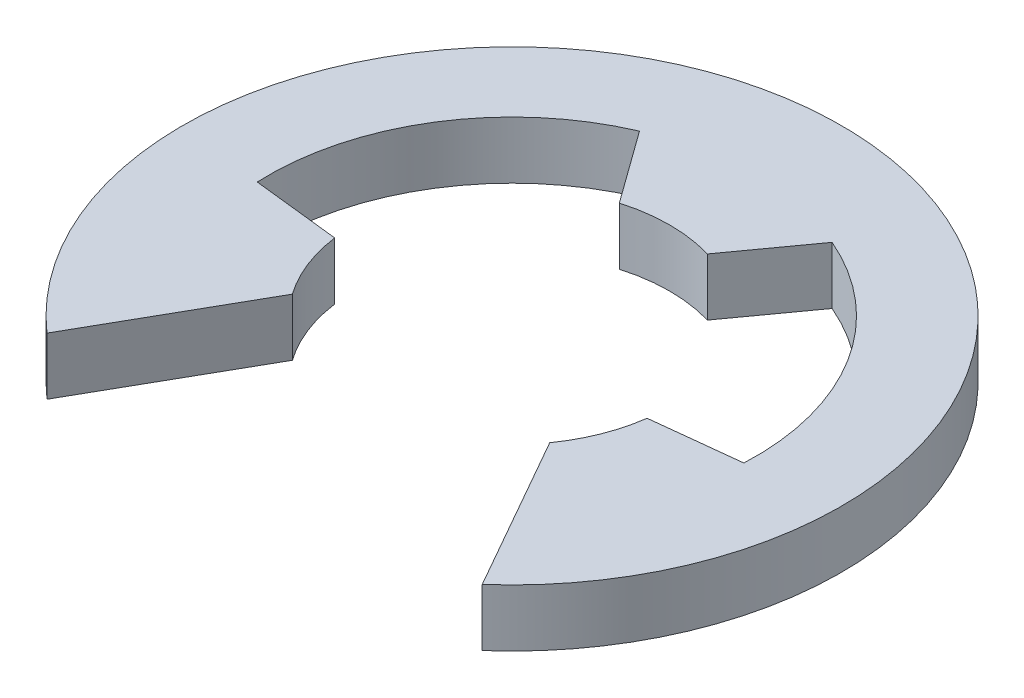
ISO-10303-21;
HEADER;
FILE_DESCRIPTION(('STEP AP214'),'2;1');
FILE_NAME('part.step','',(''),(''),'','','');
FILE_SCHEMA(('AUTOMOTIVE_DESIGN { 1 0 10303 214 1 1 1 1 }'));
ENDSEC;
DATA;
#1=APPLICATION_CONTEXT('core data for automotive mechanical design processes');
#2=APPLICATION_PROTOCOL_DEFINITION('international standard','automotive_design',2000,#1);
#3=PRODUCT_CONTEXT('',#1,'mechanical');
#4=PRODUCT('Part','Part','',(#3));
#5=PRODUCT_RELATED_PRODUCT_CATEGORY('part','',(#4));
#6=PRODUCT_DEFINITION_FORMATION('','',#4);
#7=PRODUCT_DEFINITION_CONTEXT('part definition',#1,'design');
#8=PRODUCT_DEFINITION('design','',#6,#7);
#9=PRODUCT_DEFINITION_SHAPE('','',#8);
#10=(LENGTH_UNIT() NAMED_UNIT(*) SI_UNIT(.MILLI.,.METRE.));
#11=(NAMED_UNIT(*) PLANE_ANGLE_UNIT() SI_UNIT($,.RADIAN.));
#12=(NAMED_UNIT(*) SI_UNIT($,.STERADIAN.) SOLID_ANGLE_UNIT());
#13=UNCERTAINTY_MEASURE_WITH_UNIT(LENGTH_MEASURE(1.E-05),#10,'distance_accuracy_value','');
#14=(GEOMETRIC_REPRESENTATION_CONTEXT(3) GLOBAL_UNCERTAINTY_ASSIGNED_CONTEXT((#13)) GLOBAL_UNIT_ASSIGNED_CONTEXT((#10,
#11,#12)) REPRESENTATION_CONTEXT('',''));
#15=CARTESIAN_POINT('',(0.,0.,0.));
#16=DIRECTION('',(0.,0.,1.));
#17=DIRECTION('',(1.,0.,0.));
#18=AXIS2_PLACEMENT_3D('',#15,#16,#17);
#19=CARTESIAN_POINT('',(1.929015529,0.,2.193431123));
#20=DIRECTION('',(0.86935088519939,0.,-0.494195344376126));
#21=DIRECTION('',(-0.494195344376126,0.,-0.86935088519939));
#22=AXIS2_PLACEMENT_3D('',#19,#20,#21);
#23=PLANE('',#22);
#24=DIRECTION('',(0.,-1.,0.));
#25=VECTOR('',#24,1.);
#26=CARTESIAN_POINT('',(1.92901552951474,0.254,2.19343112198468));
#27=LINE('',#26,#25);
#28=CARTESIAN_POINT('',(1.92901552968591,0.,2.19343112183415));
#29=VERTEX_POINT('',#28);
#30=CARTESIAN_POINT('',(1.92901552915076,0.508,2.19343112230479));
#31=VERTEX_POINT('',#30);
#32=EDGE_CURVE('E116',#29,#31,#27,.F.);
#33=ORIENTED_EDGE('',*,*,#32,.T.);
#34=DIRECTION('',(-0.494195344376126,0.,-0.86935088519939));
#35=VECTOR('',#34,1.);
#36=CARTESIAN_POINT('',(1.929015529,0.508,2.193431123));
#37=LINE('',#36,#35);
#38=CARTESIAN_POINT('',(1.14063546282,0.508,0.806572836734169));
#39=VERTEX_POINT('',#38);
#40=EDGE_CURVE('E125',#31,#39,#37,.T.);
#41=ORIENTED_EDGE('',*,*,#40,.T.);
#42=DIRECTION('',(0.,-1.,0.));
#43=VECTOR('',#42,1.);
#44=CARTESIAN_POINT('',(1.14063546280399,0.254,0.806572836756812));
#45=LINE('',#44,#43);
#46=CARTESIAN_POINT('',(1.14063546233232,0.,0.806572837423838));
#47=VERTEX_POINT('',#46);
#48=EDGE_CURVE('E159',#47,#39,#45,.F.);
#49=ORIENTED_EDGE('',*,*,#48,.F.);
#50=DIRECTION('',(-0.49419534597024,0.,-0.869350884293192));
#51=VECTOR('',#50,1.);
#52=CARTESIAN_POINT('',(1.92901552946643,0.,2.19343112099644));
#53=LINE('',#52,#51);
#54=EDGE_CURVE('E120',#29,#47,#53,.T.);
#55=ORIENTED_EDGE('',*,*,#54,.F.);
#56=EDGE_LOOP('',(#33,#41,#49,#55));
#57=FACE_BOUND('',#56,.T.);
#58=ADVANCED_FACE('F17',(#57),#23,.F.);
#59=CARTESIAN_POINT('',(0.,0.508,0.));
#60=DIRECTION('',(0.,-1.,0.));
#61=DIRECTION('',(0.,0.,-1.));
#62=AXIS2_PLACEMENT_3D('',#59,#60,#61);
#63=CYLINDRICAL_SURFACE('',#62,1.397);
#64=CARTESIAN_POINT('',(0.,0.508,0.));
#65=DIRECTION('',(0.,-1.,0.));
#66=DIRECTION('',(0.,0.,-1.));
#67=AXIS2_PLACEMENT_3D('',#64,#65,#66);
#68=CIRCLE('',#67,1.397);
#69=CARTESIAN_POINT('',(1.38434536579565,0.508,0.187608392022745));
#70=VERTEX_POINT('',#69);
#71=EDGE_CURVE('E127',#39,#70,#68,.F.);
#72=ORIENTED_EDGE('',*,*,#71,.T.);
#73=DIRECTION('',(0.,-1.,0.));
#74=VECTOR('',#73,1.);
#75=CARTESIAN_POINT('',(1.384345366,0.254,0.187608392));
#76=LINE('',#75,#74);
#77=CARTESIAN_POINT('',(1.38434536581451,0.,0.187608391883578));
#78=VERTEX_POINT('',#77);
#79=EDGE_CURVE('E162',#70,#78,#76,.T.);
#80=ORIENTED_EDGE('',*,*,#79,.T.);
#81=CARTESIAN_POINT('',(0.,0.,0.));
#82=DIRECTION('',(0.,-1.,0.));
#83=DIRECTION('',(0.,0.,-1.));
#84=AXIS2_PLACEMENT_3D('',#81,#82,#83);
#85=CIRCLE('',#84,1.397);
#86=EDGE_CURVE('E149',#47,#78,#85,.F.);
#87=ORIENTED_EDGE('',*,*,#86,.F.);
#88=ORIENTED_EDGE('',*,*,#48,.T.);
#89=EDGE_LOOP('',(#72,#80,#87,#88));
#90=FACE_BOUND('',#89,.T.);
#91=ADVANCED_FACE('F164',(#90),#63,.F.);
#92=CARTESIAN_POINT('',(1.384345366,0.,0.187608392));
#93=DIRECTION('',(0.110618200045199,0.,0.993862975373749));
#94=DIRECTION('',(0.993862975373749,0.,-0.110618200045199));
#95=AXIS2_PLACEMENT_3D('',#92,#93,#94);
#96=PLANE('',#95);
#97=ORIENTED_EDGE('',*,*,#79,.F.);
#98=DIRECTION('',(0.993862975373749,0.,-0.110618200045199));
#99=VECTOR('',#98,1.);
#100=CARTESIAN_POINT('',(1.384345366,0.508,0.187608392));
#101=LINE('',#100,#99);
#102=CARTESIAN_POINT('',(2.15660550124388,0.508,0.101654867097534));
#103=VERTEX_POINT('',#102);
#104=EDGE_CURVE('E212',#70,#103,#101,.T.);
#105=ORIENTED_EDGE('',*,*,#104,.T.);
#106=DIRECTION('',(0.,-1.,0.));
#107=VECTOR('',#106,1.);
#108=CARTESIAN_POINT('',(2.15660550123798,0.254,0.101654867222869));
#109=LINE('',#108,#107);
#110=CARTESIAN_POINT('',(2.15660550127173,0.,0.101654866506799));
#111=VERTEX_POINT('',#110);
#112=EDGE_CURVE('E169',#111,#103,#109,.F.);
#113=ORIENTED_EDGE('',*,*,#112,.F.);
#114=DIRECTION('',(0.99386297524625,0.,-0.110618201190729));
#115=VECTOR('',#114,1.);
#116=CARTESIAN_POINT('',(1.38434536586914,0.,0.187608391740431));
#117=LINE('',#116,#115);
#118=EDGE_CURVE('E146',#78,#111,#117,.T.);
#119=ORIENTED_EDGE('',*,*,#118,.F.);
#120=EDGE_LOOP('',(#97,#105,#113,#119));
#121=FACE_BOUND('',#120,.T.);
#122=ADVANCED_FACE('F171',(#121),#96,.F.);
#123=CARTESIAN_POINT('',(0.,0.508,0.));
#124=DIRECTION('',(0.,-1.,0.));
#125=DIRECTION('',(0.,0.,-1.));
#126=AXIS2_PLACEMENT_3D('',#123,#124,#125);
#127=CYLINDRICAL_SURFACE('',#126,2.159);
#128=CARTESIAN_POINT('',(0.,0.508,0.));
#129=DIRECTION('',(0.,-1.,0.));
#130=DIRECTION('',(0.,0.,-1.));
#131=AXIS2_PLACEMENT_3D('',#128,#129,#130);
#132=CIRCLE('',#131,2.159);
#133=CARTESIAN_POINT('',(0.853616211139097,0.508,-1.98308354919271));
#134=VERTEX_POINT('',#133);
#135=EDGE_CURVE('E180',#103,#134,#132,.F.);
#136=ORIENTED_EDGE('',*,*,#135,.T.);
#137=DIRECTION('',(0.,-1.,0.));
#138=VECTOR('',#137,1.);
#139=CARTESIAN_POINT('',(0.853616211,0.254,-1.983083549));
#140=LINE('',#139,#138);
#141=CARTESIAN_POINT('',(0.853616210756976,0.,-1.98308354935719));
#142=VERTEX_POINT('',#141);
#143=EDGE_CURVE('E179',#134,#142,#140,.T.);
#144=ORIENTED_EDGE('',*,*,#143,.T.);
#145=CARTESIAN_POINT('',(0.,0.,0.));
#146=DIRECTION('',(0.,-1.,0.));
#147=DIRECTION('',(0.,0.,-1.));
#148=AXIS2_PLACEMENT_3D('',#145,#146,#147);
#149=CIRCLE('',#148,2.159);
#150=EDGE_CURVE('E143',#111,#142,#149,.F.);
#151=ORIENTED_EDGE('',*,*,#150,.F.);
#152=ORIENTED_EDGE('',*,*,#112,.T.);
#153=EDGE_LOOP('',(#136,#144,#151,#152));
#154=FACE_BOUND('',#153,.T.);
#155=ADVANCED_FACE('F176',(#154),#127,.F.);
#156=CARTESIAN_POINT('',(0.853616211,0.,-1.983083549));
#157=DIRECTION('',(-0.810841332220513,0.,-0.585266036912158));
#158=DIRECTION('',(-0.585266036912158,0.,0.810841332220513));
#159=AXIS2_PLACEMENT_3D('',#156,#157,#158);
#160=PLANE('',#159);
#161=ORIENTED_EDGE('',*,*,#143,.F.);
#162=DIRECTION('',(-0.585266036912158,0.,0.810841332220513));
#163=VECTOR('',#162,1.);
#164=CARTESIAN_POINT('',(0.853616211,0.508,-1.983083549));
#165=LINE('',#164,#163);
#166=CARTESIAN_POINT('',(0.39040508032633,0.508,-1.34133995439463));
#167=VERTEX_POINT('',#166);
#168=EDGE_CURVE('E189',#134,#167,#165,.T.);
#169=ORIENTED_EDGE('',*,*,#168,.T.);
#170=DIRECTION('',(0.,-1.,0.));
#171=VECTOR('',#170,1.);
#172=CARTESIAN_POINT('',(0.390405080360612,0.254,-1.34133995438465));
#173=LINE('',#172,#171);
#174=CARTESIAN_POINT('',(0.390405080040821,0.,-1.34133995447773));
#175=VERTEX_POINT('',#174);
#176=EDGE_CURVE('E184',#175,#167,#173,.F.);
#177=ORIENTED_EDGE('',*,*,#176,.F.);
#178=DIRECTION('',(-0.585266036654048,0.,0.810841332406817));
#179=VECTOR('',#178,1.);
#180=CARTESIAN_POINT('',(0.85361620954852,0.,-1.98308354837685));
#181=LINE('',#180,#179);
#182=EDGE_CURVE('E140',#142,#175,#181,.T.);
#183=ORIENTED_EDGE('',*,*,#182,.F.);
#184=EDGE_LOOP('',(#161,#169,#177,#183));
#185=FACE_BOUND('',#184,.T.);
#186=ADVANCED_FACE('F187',(#185),#160,.F.);
#187=CARTESIAN_POINT('',(0.,0.508,0.));
#188=DIRECTION('',(0.,-1.,0.));
#189=DIRECTION('',(0.,0.,-1.));
#190=AXIS2_PLACEMENT_3D('',#187,#188,#189);
#191=CYLINDRICAL_SURFACE('',#190,1.397);
#192=DIRECTION('',(0.,-1.,0.));
#193=VECTOR('',#192,1.);
#194=CARTESIAN_POINT('',(-0.39040508,0.254,-1.341339954));
#195=LINE('',#194,#193);
#196=CARTESIAN_POINT('',(-0.390405080146024,0.508,-1.3413399542023));
#197=VERTEX_POINT('',#196);
#198=CARTESIAN_POINT('',(-0.390405079860515,0.,-1.3413399542854));
#199=VERTEX_POINT('',#198);
#200=EDGE_CURVE('E191',#197,#199,#195,.T.);
#201=ORIENTED_EDGE('',*,*,#200,.T.);
#202=CARTESIAN_POINT('',(0.,0.,0.));
#203=DIRECTION('',(0.,-1.,0.));
#204=DIRECTION('',(0.,0.,-1.));
#205=AXIS2_PLACEMENT_3D('',#202,#203,#204);
#206=CIRCLE('',#205,1.397);
#207=EDGE_CURVE('E137',#175,#199,#206,.F.);
#208=ORIENTED_EDGE('',*,*,#207,.F.);
#209=ORIENTED_EDGE('',*,*,#176,.T.);
#210=CARTESIAN_POINT('',(0.,0.508,0.));
#211=DIRECTION('',(0.,-1.,0.));
#212=DIRECTION('',(0.,0.,-1.));
#213=AXIS2_PLACEMENT_3D('',#210,#211,#212);
#214=CIRCLE('',#213,1.397);
#215=EDGE_CURVE('E208',#167,#197,#214,.F.);
#216=ORIENTED_EDGE('',*,*,#215,.T.);
#217=EDGE_LOOP('',(#201,#208,#209,#216));
#218=FACE_BOUND('',#217,.T.);
#219=ADVANCED_FACE('F217',(#218),#191,.F.);
#220=CARTESIAN_POINT('',(-0.39040508,0.,-1.341339954));
#221=DIRECTION('',(0.810841332220513,0.,-0.585266036912158));
#222=DIRECTION('',(-0.585266036912158,0.,-0.810841332220513));
#223=AXIS2_PLACEMENT_3D('',#220,#221,#222);
#224=PLANE('',#223);
#225=ORIENTED_EDGE('',*,*,#200,.F.);
#226=DIRECTION('',(-0.585266036912158,0.,-0.810841332220513));
#227=VECTOR('',#226,1.);
#228=CARTESIAN_POINT('',(-0.39040508,0.508,-1.341339954));
#229=LINE('',#228,#227);
#230=CARTESIAN_POINT('',(-0.853616211784646,0.508,-1.98308354916741));
#231=VERTEX_POINT('',#230);
#232=EDGE_CURVE('E206',#197,#231,#229,.T.);
#233=ORIENTED_EDGE('',*,*,#232,.T.);
#234=DIRECTION('',(0.,-1.,0.));
#235=VECTOR('',#234,1.);
#236=CARTESIAN_POINT('',(-0.853616212291097,0.254,-1.98308354894941));
#237=LINE('',#236,#235);
#238=CARTESIAN_POINT('',(-0.853616211402524,0.,-1.9830835493319));
#239=VERTEX_POINT('',#238);
#240=EDGE_CURVE('E193',#239,#231,#237,.F.);
#241=ORIENTED_EDGE('',*,*,#240,.F.);
#242=DIRECTION('',(-0.585266036654048,0.,-0.810841332406817));
#243=VECTOR('',#242,1.);
#244=CARTESIAN_POINT('',(-0.390405078187519,0.,-1.34133995244625));
#245=LINE('',#244,#243);
#246=EDGE_CURVE('E134',#199,#239,#245,.T.);
#247=ORIENTED_EDGE('',*,*,#246,.F.);
#248=EDGE_LOOP('',(#225,#233,#241,#247));
#249=FACE_BOUND('',#248,.T.);
#250=ADVANCED_FACE('F220',(#249),#224,.F.);
#251=CARTESIAN_POINT('',(0.,0.508,0.));
#252=DIRECTION('',(0.,-1.,0.));
#253=DIRECTION('',(0.,0.,-1.));
#254=AXIS2_PLACEMENT_3D('',#251,#252,#253);
#255=CYLINDRICAL_SURFACE('',#254,2.159);
#256=CARTESIAN_POINT('',(0.,0.508,0.));
#257=DIRECTION('',(0.,-1.,0.));
#258=DIRECTION('',(0.,0.,-1.));
#259=AXIS2_PLACEMENT_3D('',#256,#257,#258);
#260=CIRCLE('',#259,2.159);
#261=CARTESIAN_POINT('',(-2.1566055011249,0.508,0.101654866986099));
#262=VERTEX_POINT('',#261);
#263=EDGE_CURVE('E204',#231,#262,#260,.F.);
#264=ORIENTED_EDGE('',*,*,#263,.T.);
#265=DIRECTION('',(0.,-1.,0.));
#266=VECTOR('',#265,1.);
#267=CARTESIAN_POINT('',(-2.156605501,0.254,0.101654867));
#268=LINE('',#267,#266);
#269=CARTESIAN_POINT('',(-2.15660550115274,0.,0.101654866395364));
#270=VERTEX_POINT('',#269);
#271=EDGE_CURVE('E226',#262,#270,#268,.T.);
#272=ORIENTED_EDGE('',*,*,#271,.T.);
#273=CARTESIAN_POINT('',(0.,0.,0.));
#274=DIRECTION('',(0.,-1.,0.));
#275=DIRECTION('',(0.,0.,-1.));
#276=AXIS2_PLACEMENT_3D('',#273,#274,#275);
#277=CIRCLE('',#276,2.159);
#278=EDGE_CURVE('E129',#239,#270,#277,.F.);
#279=ORIENTED_EDGE('',*,*,#278,.F.);
#280=ORIENTED_EDGE('',*,*,#240,.T.);
#281=EDGE_LOOP('',(#264,#272,#279,#280));
#282=FACE_BOUND('',#281,.T.);
#283=ADVANCED_FACE('F224',(#282),#255,.F.);
#284=CARTESIAN_POINT('',(-2.156605501,0.,0.101654867));
#285=DIRECTION('',(-0.110618200045199,0.,0.993862975373749));
#286=DIRECTION('',(0.993862975373749,0.,0.110618200045199));
#287=AXIS2_PLACEMENT_3D('',#284,#285,#286);
#288=PLANE('',#287);
#289=ORIENTED_EDGE('',*,*,#271,.F.);
#290=DIRECTION('',(0.993862975373749,0.,0.110618200045199));
#291=VECTOR('',#290,1.);
#292=CARTESIAN_POINT('',(-2.156605501,0.508,0.101654867));
#293=LINE('',#292,#291);
#294=CARTESIAN_POINT('',(-1.38434536563138,0.508,0.187608391749766));
#295=VERTEX_POINT('',#294);
#296=EDGE_CURVE('E202',#262,#295,#293,.T.);
#297=ORIENTED_EDGE('',*,*,#296,.T.);
#298=DIRECTION('',(0.,-1.,0.));
#299=VECTOR('',#298,1.);
#300=CARTESIAN_POINT('',(-1.38434536567145,0.254,0.187608391454042));
#301=LINE('',#300,#299);
#302=CARTESIAN_POINT('',(-1.38434536565024,0.,0.187608391610599));
#303=VERTEX_POINT('',#302);
#304=EDGE_CURVE('E229',#303,#295,#301,.F.);
#305=ORIENTED_EDGE('',*,*,#304,.F.);
#306=DIRECTION('',(0.99386297524625,0.,0.110618201190729));
#307=VECTOR('',#306,1.);
#308=CARTESIAN_POINT('',(-2.15660550247252,0.,0.101654865660836));
#309=LINE('',#308,#307);
#310=EDGE_CURVE('E124',#270,#303,#309,.T.);
#311=ORIENTED_EDGE('',*,*,#310,.F.);
#312=EDGE_LOOP('',(#289,#297,#305,#311));
#313=FACE_BOUND('',#312,.T.);
#314=ADVANCED_FACE('F231',(#313),#288,.F.);
#315=CARTESIAN_POINT('',(0.,0.508,0.));
#316=DIRECTION('',(0.,-1.,0.));
#317=DIRECTION('',(0.,0.,-1.));
#318=AXIS2_PLACEMENT_3D('',#315,#316,#317);
#319=CYLINDRICAL_SURFACE('',#318,1.397);
#320=CARTESIAN_POINT('',(0.,0.508,0.));
#321=DIRECTION('',(0.,-1.,0.));
#322=DIRECTION('',(0.,0.,-1.));
#323=AXIS2_PLACEMENT_3D('',#320,#321,#322);
#324=CIRCLE('',#323,1.397);
#325=CARTESIAN_POINT('',(-1.14063546291801,0.508,0.806572836855763));
#326=VERTEX_POINT('',#325);
#327=EDGE_CURVE('E114',#295,#326,#324,.F.);
#328=ORIENTED_EDGE('',*,*,#327,.T.);
#329=DIRECTION('',(0.,-1.,0.));
#330=VECTOR('',#329,1.);
#331=CARTESIAN_POINT('',(-1.140635463,0.254,0.806572837));
#332=LINE('',#331,#330);
#333=CARTESIAN_POINT('',(-1.14063546243032,0.,0.806572837545432));
#334=VERTEX_POINT('',#333);
#335=EDGE_CURVE('E107',#326,#334,#332,.T.);
#336=ORIENTED_EDGE('',*,*,#335,.T.);
#337=CARTESIAN_POINT('',(0.,0.,0.));
#338=DIRECTION('',(0.,-1.,0.));
#339=DIRECTION('',(0.,0.,-1.));
#340=AXIS2_PLACEMENT_3D('',#337,#338,#339);
#341=CIRCLE('',#340,1.397);
#342=EDGE_CURVE('E111',#303,#334,#341,.F.);
#343=ORIENTED_EDGE('',*,*,#342,.F.);
#344=ORIENTED_EDGE('',*,*,#304,.T.);
#345=EDGE_LOOP('',(#328,#336,#343,#344));
#346=FACE_BOUND('',#345,.T.);
#347=ADVANCED_FACE('F108',(#346),#319,.F.);
#348=CARTESIAN_POINT('',(-1.140635463,0.,0.806572837));
#349=DIRECTION('',(-0.86935088519939,0.,-0.494195344376126));
#350=DIRECTION('',(-0.494195344376126,0.,0.86935088519939));
#351=AXIS2_PLACEMENT_3D('',#348,#349,#350);
#352=PLANE('',#351);
#353=ORIENTED_EDGE('',*,*,#335,.F.);
#354=DIRECTION('',(-0.494195344376126,0.,0.86935088519939));
#355=VECTOR('',#354,1.);
#356=CARTESIAN_POINT('',(-1.140635463,0.508,0.806572837));
#357=LINE('',#356,#355);
#358=CARTESIAN_POINT('',(-1.92901552889338,0.508,2.19343112281245));
#359=VERTEX_POINT('',#358);
#360=EDGE_CURVE('E199',#326,#359,#357,.T.);
#361=ORIENTED_EDGE('',*,*,#360,.T.);
#362=DIRECTION('',(0.,1.,0.));
#363=VECTOR('',#362,1.);
#364=CARTESIAN_POINT('',(-1.929015529,0.254,2.193431123));
#365=LINE('',#364,#363);
#366=CARTESIAN_POINT('',(-1.92901552942853,0.,2.19343112234181));
#367=VERTEX_POINT('',#366);
#368=EDGE_CURVE('E34',#367,#359,#365,.T.);
#369=ORIENTED_EDGE('',*,*,#368,.F.);
#370=DIRECTION('',(-0.49419534597024,0.,0.869350884293192));
#371=VECTOR('',#370,1.);
#372=CARTESIAN_POINT('',(-1.14063546192085,0.,0.80657283819678));
#373=LINE('',#372,#371);
#374=EDGE_CURVE('E21',#334,#367,#373,.T.);
#375=ORIENTED_EDGE('',*,*,#374,.F.);
#376=EDGE_LOOP('',(#353,#361,#369,#375));
#377=FACE_BOUND('',#376,.T.);
#378=ADVANCED_FACE('F118',(#377),#352,.F.);
#379=CARTESIAN_POINT('',(-2.956052,0.,2.224117709));
#380=DIRECTION('',(0.,-1.,0.));
#381=DIRECTION('',(0.,0.,-1.));
#382=AXIS2_PLACEMENT_3D('',#379,#380,#381);
#383=PLANE('',#382);
#384=ORIENTED_EDGE('',*,*,#310,.T.);
#385=ORIENTED_EDGE('',*,*,#342,.T.);
#386=ORIENTED_EDGE('',*,*,#374,.T.);
#387=CARTESIAN_POINT('',(0.,0.,0.));
#388=DIRECTION('',(0.,-1.,0.));
#389=DIRECTION('',(0.,0.,-1.));
#390=AXIS2_PLACEMENT_3D('',#387,#388,#389);
#391=CIRCLE('',#390,2.921);
#392=EDGE_CURVE('E26',#367,#29,#391,.T.);
#393=ORIENTED_EDGE('',*,*,#392,.T.);
#394=ORIENTED_EDGE('',*,*,#54,.T.);
#395=ORIENTED_EDGE('',*,*,#86,.T.);
#396=ORIENTED_EDGE('',*,*,#118,.T.);
#397=ORIENTED_EDGE('',*,*,#150,.T.);
#398=ORIENTED_EDGE('',*,*,#182,.T.);
#399=ORIENTED_EDGE('',*,*,#207,.T.);
#400=ORIENTED_EDGE('',*,*,#246,.T.);
#401=ORIENTED_EDGE('',*,*,#278,.T.);
#402=EDGE_LOOP('',(#384,#385,#386,#393,#394,#395,#396,#397,#398,#399,#400,#401));
#403=FACE_BOUND('',#402,.T.);
#404=ADVANCED_FACE('F121',(#403),#383,.T.);
#405=CARTESIAN_POINT('',(-2.956052,0.508,2.224117709));
#406=DIRECTION('',(0.,-1.,0.));
#407=DIRECTION('',(0.,0.,-1.));
#408=AXIS2_PLACEMENT_3D('',#405,#406,#407);
#409=PLANE('',#408);
#410=CARTESIAN_POINT('',(0.,0.508,0.));
#411=DIRECTION('',(0.,-1.,0.));
#412=DIRECTION('',(0.,0.,-1.));
#413=AXIS2_PLACEMENT_3D('',#410,#411,#412);
#414=CIRCLE('',#413,2.921);
#415=EDGE_CURVE('E11',#31,#359,#414,.F.);
#416=ORIENTED_EDGE('',*,*,#415,.T.);
#417=ORIENTED_EDGE('',*,*,#360,.F.);
#418=ORIENTED_EDGE('',*,*,#327,.F.);
#419=ORIENTED_EDGE('',*,*,#296,.F.);
#420=ORIENTED_EDGE('',*,*,#263,.F.);
#421=ORIENTED_EDGE('',*,*,#232,.F.);
#422=ORIENTED_EDGE('',*,*,#215,.F.);
#423=ORIENTED_EDGE('',*,*,#168,.F.);
#424=ORIENTED_EDGE('',*,*,#135,.F.);
#425=ORIENTED_EDGE('',*,*,#104,.F.);
#426=ORIENTED_EDGE('',*,*,#71,.F.);
#427=ORIENTED_EDGE('',*,*,#40,.F.);
#428=EDGE_LOOP('',(#416,#417,#418,#419,#420,#421,#422,#423,#424,#425,#426,#427));
#429=FACE_BOUND('',#428,.T.);
#430=ADVANCED_FACE('F19',(#429),#409,.F.);
#431=CARTESIAN_POINT('',(0.,0.508,0.));
#432=DIRECTION('',(0.,-1.,0.));
#433=DIRECTION('',(0.,0.,-1.));
#434=AXIS2_PLACEMENT_3D('',#431,#432,#433);
#435=CYLINDRICAL_SURFACE('',#434,2.921);
#436=ORIENTED_EDGE('',*,*,#415,.F.);
#437=ORIENTED_EDGE('',*,*,#32,.F.);
#438=ORIENTED_EDGE('',*,*,#392,.F.);
#439=ORIENTED_EDGE('',*,*,#368,.T.);
#440=EDGE_LOOP('',(#436,#437,#438,#439));
#441=FACE_BOUND('',#440,.T.);
#442=ADVANCED_FACE('F235',(#441),#435,.T.);
#443=CLOSED_SHELL('',(#58,#91,#122,#155,#186,#219,#250,#283,#314,#347,#378,#404,#430,#442));
#444=MANIFOLD_SOLID_BREP('B1',#443);
#445=ADVANCED_BREP_SHAPE_REPRESENTATION('',(#18,#444),#14);
#446=SHAPE_DEFINITION_REPRESENTATION(#9,#445);
ENDSEC;
END-ISO-10303-21;
